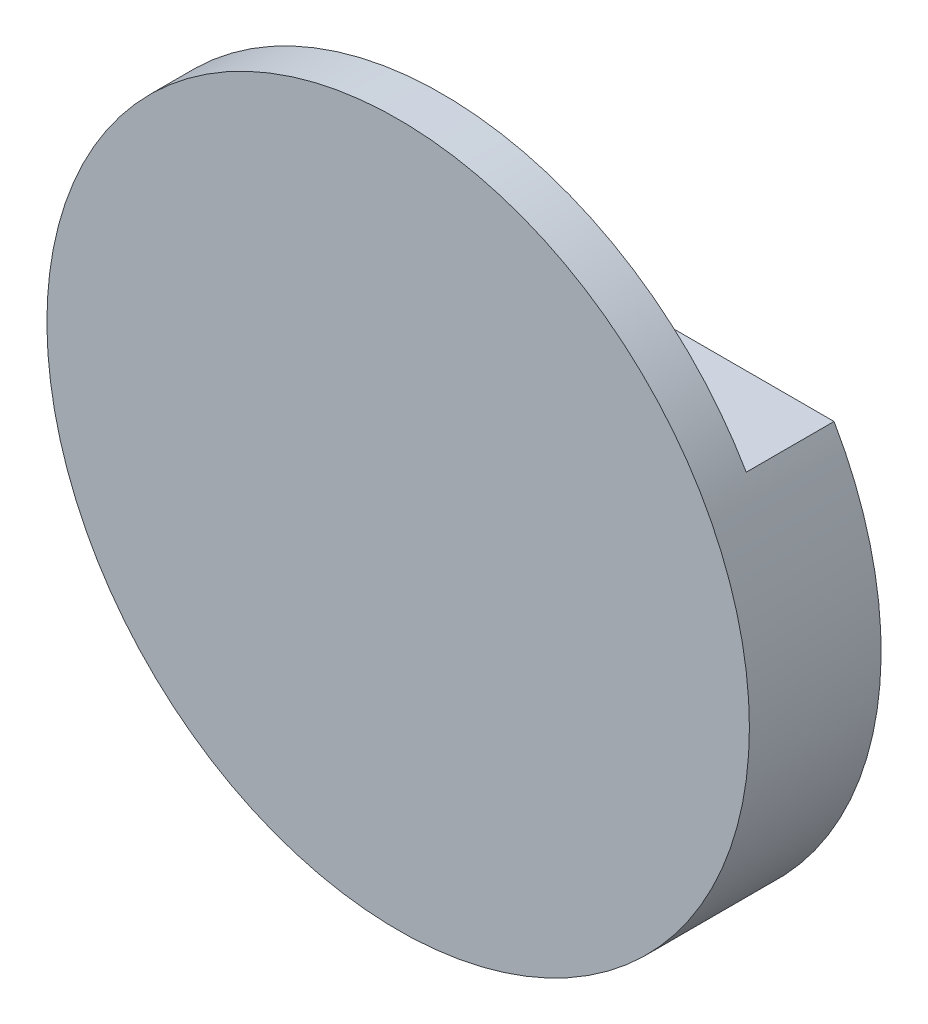
ISO-10303-21;
HEADER;
FILE_DESCRIPTION(('STEP AP214'),'2;1');
FILE_NAME('part.step','',(''),(''),'','','');
FILE_SCHEMA(('AUTOMOTIVE_DESIGN { 1 0 10303 214 1 1 1 1 }'));
ENDSEC;
DATA;
#1=APPLICATION_CONTEXT('core data for automotive mechanical design processes');
#2=APPLICATION_PROTOCOL_DEFINITION('international standard','automotive_design',2000,#1);
#3=PRODUCT_CONTEXT('',#1,'mechanical');
#4=PRODUCT('Part','Part','',(#3));
#5=PRODUCT_RELATED_PRODUCT_CATEGORY('part','',(#4));
#6=PRODUCT_DEFINITION_FORMATION('','',#4);
#7=PRODUCT_DEFINITION_CONTEXT('part definition',#1,'design');
#8=PRODUCT_DEFINITION('design','',#6,#7);
#9=PRODUCT_DEFINITION_SHAPE('','',#8);
#10=(LENGTH_UNIT() NAMED_UNIT(*) SI_UNIT(.MILLI.,.METRE.));
#11=(NAMED_UNIT(*) PLANE_ANGLE_UNIT() SI_UNIT($,.RADIAN.));
#12=(NAMED_UNIT(*) SI_UNIT($,.STERADIAN.) SOLID_ANGLE_UNIT());
#13=UNCERTAINTY_MEASURE_WITH_UNIT(LENGTH_MEASURE(1.E-05),#10,'distance_accuracy_value','');
#14=(GEOMETRIC_REPRESENTATION_CONTEXT(3) GLOBAL_UNCERTAINTY_ASSIGNED_CONTEXT((#13)) GLOBAL_UNIT_ASSIGNED_CONTEXT((#10,
#11,#12)) REPRESENTATION_CONTEXT('',''));
#15=CARTESIAN_POINT('',(0.,0.,0.));
#16=DIRECTION('',(0.,0.,1.));
#17=DIRECTION('',(1.,0.,0.));
#18=AXIS2_PLACEMENT_3D('',#15,#16,#17);
#19=CARTESIAN_POINT('',(-1.5875,3.175,1.5875));
#20=DIRECTION('',(0.,-1.,0.));
#21=DIRECTION('',(0.,0.,-1.));
#22=AXIS2_PLACEMENT_3D('',#19,#20,#21);
#23=PLANE('',#22);
#24=DIRECTION('',(-1.,0.,0.));
#25=VECTOR('',#24,1.);
#26=CARTESIAN_POINT('',(-1.5875,3.175,0.));
#27=LINE('',#26,#25);
#28=CARTESIAN_POINT('',(-1.5875,3.175,0.));
#29=VERTEX_POINT('',#28);
#30=CARTESIAN_POINT('',(-5.49926131403119,3.175,0.));
#31=VERTEX_POINT('',#30);
#32=EDGE_CURVE('E247',#29,#31,#27,.T.);
#33=ORIENTED_EDGE('',*,*,#32,.T.);
#34=DIRECTION('',(0.,0.,-1.));
#35=VECTOR('',#34,1.);
#36=CARTESIAN_POINT('',(-5.49926131403119,3.175,1.5875));
#37=LINE('',#36,#35);
#38=CARTESIAN_POINT('',(-5.49926131403119,3.175,1.5875));
#39=VERTEX_POINT('',#38);
#40=EDGE_CURVE('E176',#39,#31,#37,.T.);
#41=ORIENTED_EDGE('',*,*,#40,.F.);
#42=DIRECTION('',(-1.,0.,0.));
#43=VECTOR('',#42,1.);
#44=CARTESIAN_POINT('',(-1.5875,3.175,1.5875));
#45=LINE('',#44,#43);
#46=CARTESIAN_POINT('',(-1.5875,3.175,1.5875));
#47=VERTEX_POINT('',#46);
#48=EDGE_CURVE('E161',#47,#39,#45,.T.);
#49=ORIENTED_EDGE('',*,*,#48,.F.);
#50=DIRECTION('',(0.,0.,-1.));
#51=VECTOR('',#50,1.);
#52=CARTESIAN_POINT('',(-1.5875,3.175,1.5875));
#53=LINE('',#52,#51);
#54=EDGE_CURVE('E168',#47,#29,#53,.T.);
#55=ORIENTED_EDGE('',*,*,#54,.T.);
#56=EDGE_LOOP('',(#33,#41,#49,#55));
#57=FACE_BOUND('',#56,.T.);
#58=ADVANCED_FACE('F32',(#57),#23,.F.);
#59=CARTESIAN_POINT('',(0.,0.,1.5875));
#60=DIRECTION('',(0.,0.,-1.));
#61=DIRECTION('',(-1.,0.,0.));
#62=AXIS2_PLACEMENT_3D('',#59,#60,#61);
#63=CYLINDRICAL_SURFACE('',#62,6.35);
#64=CARTESIAN_POINT('',(0.,0.,0.));
#65=DIRECTION('',(0.,0.,1.));
#66=DIRECTION('',(1.,0.,0.));
#67=AXIS2_PLACEMENT_3D('',#64,#65,#66);
#68=CIRCLE('',#67,6.35);
#69=CARTESIAN_POINT('',(5.49926131403118,3.175,0.));
#70=VERTEX_POINT('',#69);
#71=EDGE_CURVE('E249',#31,#70,#68,.T.);
#72=ORIENTED_EDGE('',*,*,#71,.T.);
#73=DIRECTION('',(0.,0.,-1.));
#74=VECTOR('',#73,1.);
#75=CARTESIAN_POINT('',(5.49926131403118,3.175,1.5875));
#76=LINE('',#75,#74);
#77=CARTESIAN_POINT('',(5.49926131403118,3.175,1.5875));
#78=VERTEX_POINT('',#77);
#79=EDGE_CURVE('E207',#78,#70,#76,.T.);
#80=ORIENTED_EDGE('',*,*,#79,.F.);
#81=CARTESIAN_POINT('',(0.,0.,1.5875));
#82=DIRECTION('',(0.,0.,1.));
#83=DIRECTION('',(1.,0.,0.));
#84=AXIS2_PLACEMENT_3D('',#81,#82,#83);
#85=CIRCLE('',#84,6.35);
#86=EDGE_CURVE('E334',#78,#39,#85,.T.);
#87=ORIENTED_EDGE('',*,*,#86,.T.);
#88=ORIENTED_EDGE('',*,*,#40,.T.);
#89=EDGE_LOOP('',(#72,#80,#87,#88));
#90=FACE_BOUND('',#89,.T.);
#91=CARTESIAN_POINT('',(0.,0.,2.38125));
#92=DIRECTION('',(0.,0.,1.));
#93=DIRECTION('',(1.,0.,0.));
#94=AXIS2_PLACEMENT_3D('',#91,#92,#93);
#95=CIRCLE('',#94,6.35);
#96=CARTESIAN_POINT('',(6.35,0.,2.38125));
#97=VERTEX_POINT('',#96);
#98=EDGE_CURVE('E250',#97,#97,#95,.T.);
#99=ORIENTED_EDGE('',*,*,#98,.F.);
#100=EDGE_LOOP('',(#99));
#101=FACE_BOUND('',#100,.T.);
#102=ADVANCED_FACE('F332',(#90,#101),#63,.T.);
#103=CARTESIAN_POINT('',(1.5875,3.175,1.5875));
#104=DIRECTION('',(0.,-1.,0.));
#105=DIRECTION('',(1.,0.,0.));
#106=AXIS2_PLACEMENT_3D('',#103,#104,#105);
#107=PLANE('',#106);
#108=DIRECTION('',(-1.,0.,0.));
#109=VECTOR('',#108,1.);
#110=CARTESIAN_POINT('',(1.5875,3.175,0.));
#111=LINE('',#110,#109);
#112=CARTESIAN_POINT('',(1.5875,3.175,0.));
#113=VERTEX_POINT('',#112);
#114=EDGE_CURVE('E252',#70,#113,#111,.T.);
#115=ORIENTED_EDGE('',*,*,#114,.T.);
#116=DIRECTION('',(0.,0.,-1.));
#117=VECTOR('',#116,1.);
#118=CARTESIAN_POINT('',(1.5875,3.175,1.5875));
#119=LINE('',#118,#117);
#120=CARTESIAN_POINT('',(1.5875,3.175,1.5875));
#121=VERTEX_POINT('',#120);
#122=EDGE_CURVE('E204',#121,#113,#119,.T.);
#123=ORIENTED_EDGE('',*,*,#122,.F.);
#124=DIRECTION('',(-1.,0.,0.));
#125=VECTOR('',#124,1.);
#126=CARTESIAN_POINT('',(1.5875,3.175,1.5875));
#127=LINE('',#126,#125);
#128=EDGE_CURVE('E177',#78,#121,#127,.T.);
#129=ORIENTED_EDGE('',*,*,#128,.F.);
#130=ORIENTED_EDGE('',*,*,#79,.T.);
#131=EDGE_LOOP('',(#115,#123,#129,#130));
#132=FACE_BOUND('',#131,.T.);
#133=ADVANCED_FACE('F339',(#132),#107,.F.);
#134=CARTESIAN_POINT('',(1.5875,3.175,1.5875));
#135=DIRECTION('',(1.,0.,0.));
#136=DIRECTION('',(0.,1.,0.));
#137=AXIS2_PLACEMENT_3D('',#134,#135,#136);
#138=PLANE('',#137);
#139=DIRECTION('',(0.,-1.,0.));
#140=VECTOR('',#139,1.);
#141=CARTESIAN_POINT('',(1.5875,3.175,0.));
#142=LINE('',#141,#140);
#143=CARTESIAN_POINT('',(1.5875,2.0875,0.));
#144=VERTEX_POINT('',#143);
#145=EDGE_CURVE('E254',#113,#144,#142,.T.);
#146=ORIENTED_EDGE('',*,*,#145,.T.);
#147=DIRECTION('',(0.,0.,-1.));
#148=VECTOR('',#147,1.);
#149=CARTESIAN_POINT('',(1.5875,2.0875,1.5875));
#150=LINE('',#149,#148);
#151=CARTESIAN_POINT('',(1.5875,2.0875,1.5875));
#152=VERTEX_POINT('',#151);
#153=EDGE_CURVE('E47',#144,#152,#150,.F.);
#154=ORIENTED_EDGE('',*,*,#153,.T.);
#155=DIRECTION('',(0.,-1.,0.));
#156=VECTOR('',#155,1.);
#157=CARTESIAN_POINT('',(1.5875,3.175,1.5875));
#158=LINE('',#157,#156);
#159=EDGE_CURVE('E214',#121,#152,#158,.T.);
#160=ORIENTED_EDGE('',*,*,#159,.F.);
#161=ORIENTED_EDGE('',*,*,#122,.T.);
#162=EDGE_LOOP('',(#146,#154,#160,#161));
#163=FACE_BOUND('',#162,.T.);
#164=ADVANCED_FACE('F341',(#163),#138,.F.);
#165=CARTESIAN_POINT('',(1.5875,1.5875,1.5875));
#166=DIRECTION('',(0.,1.,0.));
#167=DIRECTION('',(0.,0.,1.));
#168=AXIS2_PLACEMENT_3D('',#165,#166,#167);
#169=PLANE('',#168);
#170=DIRECTION('',(1.,0.,0.));
#171=VECTOR('',#170,1.);
#172=CARTESIAN_POINT('',(1.5875,1.5875,1.5875));
#173=LINE('',#172,#171);
#174=CARTESIAN_POINT('',(2.0875,1.5875,1.5875));
#175=VERTEX_POINT('',#174);
#176=CARTESIAN_POINT('',(3.175,1.5875,1.5875));
#177=VERTEX_POINT('',#176);
#178=EDGE_CURVE('E225',#175,#177,#173,.T.);
#179=ORIENTED_EDGE('',*,*,#178,.F.);
#180=DIRECTION('',(0.,0.,-1.));
#181=VECTOR('',#180,1.);
#182=CARTESIAN_POINT('',(2.0875,1.5875,1.5875));
#183=LINE('',#182,#181);
#184=CARTESIAN_POINT('',(2.0875,1.5875,0.));
#185=VERTEX_POINT('',#184);
#186=EDGE_CURVE('E286',#175,#185,#183,.T.);
#187=ORIENTED_EDGE('',*,*,#186,.T.);
#188=DIRECTION('',(1.,0.,0.));
#189=VECTOR('',#188,1.);
#190=CARTESIAN_POINT('',(1.5875,1.5875,0.));
#191=LINE('',#190,#189);
#192=CARTESIAN_POINT('',(3.175,1.5875,0.));
#193=VERTEX_POINT('',#192);
#194=EDGE_CURVE('E256',#185,#193,#191,.T.);
#195=ORIENTED_EDGE('',*,*,#194,.T.);
#196=DIRECTION('',(0.,0.,-1.));
#197=VECTOR('',#196,1.);
#198=CARTESIAN_POINT('',(3.175,1.5875,1.5875));
#199=LINE('',#198,#197);
#200=EDGE_CURVE('E201',#177,#193,#199,.T.);
#201=ORIENTED_EDGE('',*,*,#200,.F.);
#202=EDGE_LOOP('',(#179,#187,#195,#201));
#203=FACE_BOUND('',#202,.T.);
#204=ADVANCED_FACE('F372',(#203),#169,.F.);
#205=CARTESIAN_POINT('',(3.175,1.5875,1.5875));
#206=DIRECTION('',(1.,0.,0.));
#207=DIRECTION('',(0.,1.,0.));
#208=AXIS2_PLACEMENT_3D('',#205,#206,#207);
#209=PLANE('',#208);
#210=DIRECTION('',(0.,-1.,0.));
#211=VECTOR('',#210,1.);
#212=CARTESIAN_POINT('',(3.175,1.5875,0.));
#213=LINE('',#212,#211);
#214=CARTESIAN_POINT('',(3.175,-1.5875,0.));
#215=VERTEX_POINT('',#214);
#216=EDGE_CURVE('E258',#193,#215,#213,.T.);
#217=ORIENTED_EDGE('',*,*,#216,.T.);
#218=DIRECTION('',(0.,0.,-1.));
#219=VECTOR('',#218,1.);
#220=CARTESIAN_POINT('',(3.175,-1.5875,1.5875));
#221=LINE('',#220,#219);
#222=CARTESIAN_POINT('',(3.175,-1.5875,1.5875));
#223=VERTEX_POINT('',#222);
#224=EDGE_CURVE('E198',#223,#215,#221,.T.);
#225=ORIENTED_EDGE('',*,*,#224,.F.);
#226=DIRECTION('',(0.,-1.,0.));
#227=VECTOR('',#226,1.);
#228=CARTESIAN_POINT('',(3.175,1.5875,1.5875));
#229=LINE('',#228,#227);
#230=EDGE_CURVE('E227',#177,#223,#229,.T.);
#231=ORIENTED_EDGE('',*,*,#230,.F.);
#232=ORIENTED_EDGE('',*,*,#200,.T.);
#233=EDGE_LOOP('',(#217,#225,#231,#232));
#234=FACE_BOUND('',#233,.T.);
#235=ADVANCED_FACE('F377',(#234),#209,.F.);
#236=CARTESIAN_POINT('',(1.5875,-1.5875,1.5875));
#237=DIRECTION('',(0.,-1.,0.));
#238=DIRECTION('',(0.,0.,-1.));
#239=AXIS2_PLACEMENT_3D('',#236,#237,#238);
#240=PLANE('',#239);
#241=DIRECTION('',(-1.,0.,0.));
#242=VECTOR('',#241,1.);
#243=CARTESIAN_POINT('',(1.5875,-1.5875,0.));
#244=LINE('',#243,#242);
#245=CARTESIAN_POINT('',(2.0875,-1.5875,0.));
#246=VERTEX_POINT('',#245);
#247=EDGE_CURVE('E260',#215,#246,#244,.T.);
#248=ORIENTED_EDGE('',*,*,#247,.T.);
#249=DIRECTION('',(0.,0.,-1.));
#250=VECTOR('',#249,1.);
#251=CARTESIAN_POINT('',(2.0875,-1.5875,1.5875));
#252=LINE('',#251,#250);
#253=CARTESIAN_POINT('',(2.0875,-1.5875,1.5875));
#254=VERTEX_POINT('',#253);
#255=EDGE_CURVE('E314',#246,#254,#252,.F.);
#256=ORIENTED_EDGE('',*,*,#255,.T.);
#257=DIRECTION('',(-1.,0.,0.));
#258=VECTOR('',#257,1.);
#259=CARTESIAN_POINT('',(1.5875,-1.5875,1.5875));
#260=LINE('',#259,#258);
#261=EDGE_CURVE('E230',#223,#254,#260,.T.);
#262=ORIENTED_EDGE('',*,*,#261,.F.);
#263=ORIENTED_EDGE('',*,*,#224,.T.);
#264=EDGE_LOOP('',(#248,#256,#262,#263));
#265=FACE_BOUND('',#264,.T.);
#266=ADVANCED_FACE('F381',(#265),#240,.F.);
#267=CARTESIAN_POINT('',(1.5875,-1.5875,1.5875));
#268=DIRECTION('',(1.,0.,0.));
#269=DIRECTION('',(0.,1.,0.));
#270=AXIS2_PLACEMENT_3D('',#267,#268,#269);
#271=PLANE('',#270);
#272=DIRECTION('',(0.,-1.,0.));
#273=VECTOR('',#272,1.);
#274=CARTESIAN_POINT('',(1.5875,-1.5875,1.5875));
#275=LINE('',#274,#273);
#276=CARTESIAN_POINT('',(1.5875,-2.0875,1.5875));
#277=VERTEX_POINT('',#276);
#278=CARTESIAN_POINT('',(1.5875,-3.175,1.5875));
#279=VERTEX_POINT('',#278);
#280=EDGE_CURVE('E233',#277,#279,#275,.T.);
#281=ORIENTED_EDGE('',*,*,#280,.F.);
#282=DIRECTION('',(0.,0.,-1.));
#283=VECTOR('',#282,1.);
#284=CARTESIAN_POINT('',(1.5875,-2.0875,1.5875));
#285=LINE('',#284,#283);
#286=CARTESIAN_POINT('',(1.5875,-2.0875,0.));
#287=VERTEX_POINT('',#286);
#288=EDGE_CURVE('E324',#277,#287,#285,.T.);
#289=ORIENTED_EDGE('',*,*,#288,.T.);
#290=DIRECTION('',(0.,-1.,0.));
#291=VECTOR('',#290,1.);
#292=CARTESIAN_POINT('',(1.5875,-1.5875,0.));
#293=LINE('',#292,#291);
#294=CARTESIAN_POINT('',(1.5875,-3.175,0.));
#295=VERTEX_POINT('',#294);
#296=EDGE_CURVE('E263',#287,#295,#293,.T.);
#297=ORIENTED_EDGE('',*,*,#296,.T.);
#298=DIRECTION('',(0.,0.,-1.));
#299=VECTOR('',#298,1.);
#300=CARTESIAN_POINT('',(1.5875,-3.175,1.5875));
#301=LINE('',#300,#299);
#302=EDGE_CURVE('E195',#279,#295,#301,.T.);
#303=ORIENTED_EDGE('',*,*,#302,.F.);
#304=EDGE_LOOP('',(#281,#289,#297,#303));
#305=FACE_BOUND('',#304,.T.);
#306=ADVANCED_FACE('F387',(#305),#271,.F.);
#307=CARTESIAN_POINT('',(-1.5875,-3.175,1.5875));
#308=DIRECTION('',(0.,-1.,0.));
#309=DIRECTION('',(0.,0.,-1.));
#310=AXIS2_PLACEMENT_3D('',#307,#308,#309);
#311=PLANE('',#310);
#312=DIRECTION('',(-1.,0.,0.));
#313=VECTOR('',#312,1.);
#314=CARTESIAN_POINT('',(-1.5875,-3.175,0.));
#315=LINE('',#314,#313);
#316=CARTESIAN_POINT('',(-1.5875,-3.175,0.));
#317=VERTEX_POINT('',#316);
#318=EDGE_CURVE('E265',#295,#317,#315,.T.);
#319=ORIENTED_EDGE('',*,*,#318,.T.);
#320=DIRECTION('',(0.,0.,-1.));
#321=VECTOR('',#320,1.);
#322=CARTESIAN_POINT('',(-1.5875,-3.175,1.5875));
#323=LINE('',#322,#321);
#324=CARTESIAN_POINT('',(-1.5875,-3.175,1.5875));
#325=VERTEX_POINT('',#324);
#326=EDGE_CURVE('E192',#325,#317,#323,.T.);
#327=ORIENTED_EDGE('',*,*,#326,.F.);
#328=DIRECTION('',(-1.,0.,0.));
#329=VECTOR('',#328,1.);
#330=CARTESIAN_POINT('',(-1.5875,-3.175,1.5875));
#331=LINE('',#330,#329);
#332=EDGE_CURVE('E235',#279,#325,#331,.T.);
#333=ORIENTED_EDGE('',*,*,#332,.F.);
#334=ORIENTED_EDGE('',*,*,#302,.T.);
#335=EDGE_LOOP('',(#319,#327,#333,#334));
#336=FACE_BOUND('',#335,.T.);
#337=ADVANCED_FACE('F390',(#336),#311,.F.);
#338=CARTESIAN_POINT('',(-1.5875,-1.5875,1.5875));
#339=DIRECTION('',(-1.,0.,0.));
#340=DIRECTION('',(0.,-1.,0.));
#341=AXIS2_PLACEMENT_3D('',#338,#339,#340);
#342=PLANE('',#341);
#343=DIRECTION('',(0.,1.,0.));
#344=VECTOR('',#343,1.);
#345=CARTESIAN_POINT('',(-1.5875,-1.5875,0.));
#346=LINE('',#345,#344);
#347=CARTESIAN_POINT('',(-1.5875,-2.0875,0.));
#348=VERTEX_POINT('',#347);
#349=EDGE_CURVE('E267',#317,#348,#346,.T.);
#350=ORIENTED_EDGE('',*,*,#349,.T.);
#351=DIRECTION('',(0.,0.,-1.));
#352=VECTOR('',#351,1.);
#353=CARTESIAN_POINT('',(-1.5875,-2.0875,1.5875));
#354=LINE('',#353,#352);
#355=CARTESIAN_POINT('',(-1.5875,-2.0875,1.5875));
#356=VERTEX_POINT('',#355);
#357=EDGE_CURVE('E291',#348,#356,#354,.F.);
#358=ORIENTED_EDGE('',*,*,#357,.T.);
#359=DIRECTION('',(0.,1.,0.));
#360=VECTOR('',#359,1.);
#361=CARTESIAN_POINT('',(-1.5875,-1.5875,1.5875));
#362=LINE('',#361,#360);
#363=EDGE_CURVE('E238',#325,#356,#362,.T.);
#364=ORIENTED_EDGE('',*,*,#363,.F.);
#365=ORIENTED_EDGE('',*,*,#326,.T.);
#366=EDGE_LOOP('',(#350,#358,#364,#365));
#367=FACE_BOUND('',#366,.T.);
#368=ADVANCED_FACE('F392',(#367),#342,.F.);
#369=CARTESIAN_POINT('',(-3.175,-1.5875,1.5875));
#370=DIRECTION('',(0.,-1.,0.));
#371=DIRECTION('',(1.,0.,0.));
#372=AXIS2_PLACEMENT_3D('',#369,#370,#371);
#373=PLANE('',#372);
#374=DIRECTION('',(-1.,0.,0.));
#375=VECTOR('',#374,1.);
#376=CARTESIAN_POINT('',(-3.175,-1.5875,1.5875));
#377=LINE('',#376,#375);
#378=CARTESIAN_POINT('',(-2.0875,-1.5875,1.5875));
#379=VERTEX_POINT('',#378);
#380=CARTESIAN_POINT('',(-3.175,-1.5875,1.5875));
#381=VERTEX_POINT('',#380);
#382=EDGE_CURVE('E241',#379,#381,#377,.T.);
#383=ORIENTED_EDGE('',*,*,#382,.F.);
#384=DIRECTION('',(0.,0.,-1.));
#385=VECTOR('',#384,1.);
#386=CARTESIAN_POINT('',(-2.0875,-1.5875,1.5875));
#387=LINE('',#386,#385);
#388=CARTESIAN_POINT('',(-2.0875,-1.5875,0.));
#389=VERTEX_POINT('',#388);
#390=EDGE_CURVE('E309',#379,#389,#387,.T.);
#391=ORIENTED_EDGE('',*,*,#390,.T.);
#392=DIRECTION('',(-1.,0.,0.));
#393=VECTOR('',#392,1.);
#394=CARTESIAN_POINT('',(-3.175,-1.5875,0.));
#395=LINE('',#394,#393);
#396=CARTESIAN_POINT('',(-3.175,-1.5875,0.));
#397=VERTEX_POINT('',#396);
#398=EDGE_CURVE('E270',#389,#397,#395,.T.);
#399=ORIENTED_EDGE('',*,*,#398,.T.);
#400=DIRECTION('',(0.,0.,-1.));
#401=VECTOR('',#400,1.);
#402=CARTESIAN_POINT('',(-3.175,-1.5875,1.5875));
#403=LINE('',#402,#401);
#404=EDGE_CURVE('E185',#381,#397,#403,.T.);
#405=ORIENTED_EDGE('',*,*,#404,.F.);
#406=EDGE_LOOP('',(#383,#391,#399,#405));
#407=FACE_BOUND('',#406,.T.);
#408=ADVANCED_FACE('F308',(#407),#373,.F.);
#409=CARTESIAN_POINT('',(-3.175,1.5875,1.5875));
#410=DIRECTION('',(-1.,0.,0.));
#411=DIRECTION('',(0.,0.,1.));
#412=AXIS2_PLACEMENT_3D('',#409,#410,#411);
#413=PLANE('',#412);
#414=DIRECTION('',(0.,1.,0.));
#415=VECTOR('',#414,1.);
#416=CARTESIAN_POINT('',(-3.175,1.5875,0.));
#417=LINE('',#416,#415);
#418=CARTESIAN_POINT('',(-3.175,1.5875,0.));
#419=VERTEX_POINT('',#418);
#420=EDGE_CURVE('E272',#397,#419,#417,.T.);
#421=ORIENTED_EDGE('',*,*,#420,.T.);
#422=DIRECTION('',(0.,0.,-1.));
#423=VECTOR('',#422,1.);
#424=CARTESIAN_POINT('',(-3.175,1.5875,1.5875));
#425=LINE('',#424,#423);
#426=CARTESIAN_POINT('',(-3.175,1.5875,1.5875));
#427=VERTEX_POINT('',#426);
#428=EDGE_CURVE('E182',#427,#419,#425,.T.);
#429=ORIENTED_EDGE('',*,*,#428,.F.);
#430=DIRECTION('',(0.,1.,0.));
#431=VECTOR('',#430,1.);
#432=CARTESIAN_POINT('',(-3.175,1.5875,1.5875));
#433=LINE('',#432,#431);
#434=EDGE_CURVE('E243',#381,#427,#433,.T.);
#435=ORIENTED_EDGE('',*,*,#434,.F.);
#436=ORIENTED_EDGE('',*,*,#404,.T.);
#437=EDGE_LOOP('',(#421,#429,#435,#436));
#438=FACE_BOUND('',#437,.T.);
#439=ADVANCED_FACE('F394',(#438),#413,.F.);
#440=CARTESIAN_POINT('',(-3.175,1.5875,1.5875));
#441=DIRECTION('',(0.,1.,0.));
#442=DIRECTION('',(-1.,0.,0.));
#443=AXIS2_PLACEMENT_3D('',#440,#441,#442);
#444=PLANE('',#443);
#445=DIRECTION('',(1.,0.,0.));
#446=VECTOR('',#445,1.);
#447=CARTESIAN_POINT('',(-3.175,1.5875,0.));
#448=LINE('',#447,#446);
#449=CARTESIAN_POINT('',(-2.0875,1.5875,0.));
#450=VERTEX_POINT('',#449);
#451=EDGE_CURVE('E273',#419,#450,#448,.T.);
#452=ORIENTED_EDGE('',*,*,#451,.T.);
#453=DIRECTION('',(0.,0.,-1.));
#454=VECTOR('',#453,1.);
#455=CARTESIAN_POINT('',(-2.0875,1.5875,1.5875));
#456=LINE('',#455,#454);
#457=CARTESIAN_POINT('',(-2.0875,1.5875,1.5875));
#458=VERTEX_POINT('',#457);
#459=EDGE_CURVE('E280',#450,#458,#456,.F.);
#460=ORIENTED_EDGE('',*,*,#459,.T.);
#461=DIRECTION('',(1.,0.,0.));
#462=VECTOR('',#461,1.);
#463=CARTESIAN_POINT('',(-3.175,1.5875,1.5875));
#464=LINE('',#463,#462);
#465=EDGE_CURVE('E169',#427,#458,#464,.T.);
#466=ORIENTED_EDGE('',*,*,#465,.F.);
#467=ORIENTED_EDGE('',*,*,#428,.T.);
#468=EDGE_LOOP('',(#452,#460,#466,#467));
#469=FACE_BOUND('',#468,.T.);
#470=ADVANCED_FACE('F278',(#469),#444,.F.);
#471=CARTESIAN_POINT('',(-1.5875,3.175,1.5875));
#472=DIRECTION('',(-1.,0.,0.));
#473=DIRECTION('',(0.,0.,1.));
#474=AXIS2_PLACEMENT_3D('',#471,#472,#473);
#475=PLANE('',#474);
#476=DIRECTION('',(0.,1.,0.));
#477=VECTOR('',#476,1.);
#478=CARTESIAN_POINT('',(-1.5875,3.175,1.5875));
#479=LINE('',#478,#477);
#480=CARTESIAN_POINT('',(-1.5875,2.0875,1.5875));
#481=VERTEX_POINT('',#480);
#482=EDGE_CURVE('E156',#481,#47,#479,.T.);
#483=ORIENTED_EDGE('',*,*,#482,.F.);
#484=DIRECTION('',(0.,0.,-1.));
#485=VECTOR('',#484,1.);
#486=CARTESIAN_POINT('',(-1.5875,2.0875,1.5875));
#487=LINE('',#486,#485);
#488=CARTESIAN_POINT('',(-1.5875,2.0875,0.));
#489=VERTEX_POINT('',#488);
#490=EDGE_CURVE('E287',#481,#489,#487,.T.);
#491=ORIENTED_EDGE('',*,*,#490,.T.);
#492=DIRECTION('',(0.,1.,0.));
#493=VECTOR('',#492,1.);
#494=CARTESIAN_POINT('',(-1.5875,3.175,0.));
#495=LINE('',#494,#493);
#496=EDGE_CURVE('E178',#489,#29,#495,.T.);
#497=ORIENTED_EDGE('',*,*,#496,.T.);
#498=ORIENTED_EDGE('',*,*,#54,.F.);
#499=EDGE_LOOP('',(#483,#491,#497,#498));
#500=FACE_BOUND('',#499,.T.);
#501=ADVANCED_FACE('F180',(#500),#475,.F.);
#502=CARTESIAN_POINT('',(0.,0.,0.));
#503=DIRECTION('',(0.,0.,1.));
#504=DIRECTION('',(1.,0.,0.));
#505=AXIS2_PLACEMENT_3D('',#502,#503,#504);
#506=PLANE('',#505);
#507=ORIENTED_EDGE('',*,*,#296,.F.);
#508=CARTESIAN_POINT('',(2.0875,-2.0875,0.));
#509=DIRECTION('',(0.,0.,1.));
#510=DIRECTION('',(1.,0.,0.));
#511=AXIS2_PLACEMENT_3D('',#508,#509,#510);
#512=CIRCLE('',#511,0.5);
#513=EDGE_CURVE('E316',#287,#246,#512,.F.);
#514=ORIENTED_EDGE('',*,*,#513,.T.);
#515=ORIENTED_EDGE('',*,*,#247,.F.);
#516=ORIENTED_EDGE('',*,*,#216,.F.);
#517=ORIENTED_EDGE('',*,*,#194,.F.);
#518=CARTESIAN_POINT('',(2.0875,2.0875,0.));
#519=DIRECTION('',(0.,0.,1.));
#520=DIRECTION('',(1.,0.,0.));
#521=AXIS2_PLACEMENT_3D('',#518,#519,#520);
#522=CIRCLE('',#521,0.5);
#523=EDGE_CURVE('E322',#185,#144,#522,.F.);
#524=ORIENTED_EDGE('',*,*,#523,.T.);
#525=ORIENTED_EDGE('',*,*,#145,.F.);
#526=ORIENTED_EDGE('',*,*,#114,.F.);
#527=ORIENTED_EDGE('',*,*,#71,.F.);
#528=ORIENTED_EDGE('',*,*,#32,.F.);
#529=ORIENTED_EDGE('',*,*,#496,.F.);
#530=CARTESIAN_POINT('',(-2.0875,2.0875,0.));
#531=DIRECTION('',(0.,0.,1.));
#532=DIRECTION('',(1.,0.,0.));
#533=AXIS2_PLACEMENT_3D('',#530,#531,#532);
#534=CIRCLE('',#533,0.5);
#535=EDGE_CURVE('E285',#489,#450,#534,.F.);
#536=ORIENTED_EDGE('',*,*,#535,.T.);
#537=ORIENTED_EDGE('',*,*,#451,.F.);
#538=ORIENTED_EDGE('',*,*,#420,.F.);
#539=ORIENTED_EDGE('',*,*,#398,.F.);
#540=CARTESIAN_POINT('',(-2.0875,-2.0875,0.));
#541=DIRECTION('',(0.,0.,1.));
#542=DIRECTION('',(1.,0.,0.));
#543=AXIS2_PLACEMENT_3D('',#540,#541,#542);
#544=CIRCLE('',#543,0.5);
#545=EDGE_CURVE('E313',#389,#348,#544,.F.);
#546=ORIENTED_EDGE('',*,*,#545,.T.);
#547=ORIENTED_EDGE('',*,*,#349,.F.);
#548=ORIENTED_EDGE('',*,*,#318,.F.);
#549=EDGE_LOOP('',(#507,#514,#515,#516,#517,#524,#525,#526,#527,#528,#529,#536,#537,#538,#539,
#546,#547,#548));
#550=FACE_BOUND('',#549,.T.);
#551=ADVANCED_FACE('F335',(#550),#506,.F.);
#552=CARTESIAN_POINT('',(0.,0.,1.5875));
#553=DIRECTION('',(0.,0.,1.));
#554=DIRECTION('',(1.,0.,0.));
#555=AXIS2_PLACEMENT_3D('',#552,#553,#554);
#556=PLANE('',#555);
#557=ORIENTED_EDGE('',*,*,#465,.T.);
#558=CARTESIAN_POINT('',(-2.0875,2.0875,1.5875));
#559=DIRECTION('',(0.,0.,1.));
#560=DIRECTION('',(1.,0.,0.));
#561=AXIS2_PLACEMENT_3D('',#558,#559,#560);
#562=CIRCLE('',#561,0.5);
#563=EDGE_CURVE('E40',#458,#481,#562,.T.);
#564=ORIENTED_EDGE('',*,*,#563,.T.);
#565=ORIENTED_EDGE('',*,*,#482,.T.);
#566=ORIENTED_EDGE('',*,*,#48,.T.);
#567=ORIENTED_EDGE('',*,*,#86,.F.);
#568=ORIENTED_EDGE('',*,*,#128,.T.);
#569=ORIENTED_EDGE('',*,*,#159,.T.);
#570=CARTESIAN_POINT('',(2.0875,2.0875,1.5875));
#571=DIRECTION('',(0.,0.,1.));
#572=DIRECTION('',(1.,0.,0.));
#573=AXIS2_PLACEMENT_3D('',#570,#571,#572);
#574=CIRCLE('',#573,0.5);
#575=EDGE_CURVE('E11',#152,#175,#574,.T.);
#576=ORIENTED_EDGE('',*,*,#575,.T.);
#577=ORIENTED_EDGE('',*,*,#178,.T.);
#578=ORIENTED_EDGE('',*,*,#230,.T.);
#579=ORIENTED_EDGE('',*,*,#261,.T.);
#580=CARTESIAN_POINT('',(2.0875,-2.0875,1.5875));
#581=DIRECTION('',(0.,0.,1.));
#582=DIRECTION('',(1.,0.,0.));
#583=AXIS2_PLACEMENT_3D('',#580,#581,#582);
#584=CIRCLE('',#583,0.5);
#585=EDGE_CURVE('E296',#254,#277,#584,.T.);
#586=ORIENTED_EDGE('',*,*,#585,.T.);
#587=ORIENTED_EDGE('',*,*,#280,.T.);
#588=ORIENTED_EDGE('',*,*,#332,.T.);
#589=ORIENTED_EDGE('',*,*,#363,.T.);
#590=CARTESIAN_POINT('',(-2.0875,-2.0875,1.5875));
#591=DIRECTION('',(0.,0.,1.));
#592=DIRECTION('',(1.,0.,0.));
#593=AXIS2_PLACEMENT_3D('',#590,#591,#592);
#594=CIRCLE('',#593,0.5);
#595=EDGE_CURVE('E298',#356,#379,#594,.T.);
#596=ORIENTED_EDGE('',*,*,#595,.T.);
#597=ORIENTED_EDGE('',*,*,#382,.T.);
#598=ORIENTED_EDGE('',*,*,#434,.T.);
#599=EDGE_LOOP('',(#557,#564,#565,#566,#567,#568,#569,#576,#577,#578,#579,#586,#587,#588,#589,
#596,#597,#598));
#600=FACE_BOUND('',#599,.T.);
#601=ADVANCED_FACE('F159',(#600),#556,.F.);
#602=CARTESIAN_POINT('',(0.,0.,2.38125));
#603=DIRECTION('',(0.,0.,1.));
#604=DIRECTION('',(1.,0.,0.));
#605=AXIS2_PLACEMENT_3D('',#602,#603,#604);
#606=PLANE('',#605);
#607=ORIENTED_EDGE('',*,*,#98,.T.);
#608=EDGE_LOOP('',(#607));
#609=FACE_BOUND('',#608,.T.);
#610=ADVANCED_FACE('F346',(#609),#606,.T.);
#611=CARTESIAN_POINT('',(2.0875,-2.0875,1.5875));
#612=DIRECTION('',(0.,0.,-1.));
#613=DIRECTION('',(-1.,0.,0.));
#614=AXIS2_PLACEMENT_3D('',#611,#612,#613);
#615=CYLINDRICAL_SURFACE('',#614,0.5);
#616=ORIENTED_EDGE('',*,*,#585,.F.);
#617=ORIENTED_EDGE('',*,*,#255,.F.);
#618=ORIENTED_EDGE('',*,*,#513,.F.);
#619=ORIENTED_EDGE('',*,*,#288,.F.);
#620=EDGE_LOOP('',(#616,#617,#618,#619));
#621=FACE_BOUND('',#620,.T.);
#622=ADVANCED_FACE('F357',(#621),#615,.T.);
#623=CARTESIAN_POINT('',(-2.0875,-2.0875,1.5875));
#624=DIRECTION('',(0.,0.,-1.));
#625=DIRECTION('',(-1.,0.,0.));
#626=AXIS2_PLACEMENT_3D('',#623,#624,#625);
#627=CYLINDRICAL_SURFACE('',#626,0.5);
#628=ORIENTED_EDGE('',*,*,#595,.F.);
#629=ORIENTED_EDGE('',*,*,#357,.F.);
#630=ORIENTED_EDGE('',*,*,#545,.F.);
#631=ORIENTED_EDGE('',*,*,#390,.F.);
#632=EDGE_LOOP('',(#628,#629,#630,#631));
#633=FACE_BOUND('',#632,.T.);
#634=ADVANCED_FACE('F312',(#633),#627,.T.);
#635=CARTESIAN_POINT('',(-2.0875,2.0875,1.5875));
#636=DIRECTION('',(0.,0.,-1.));
#637=DIRECTION('',(-1.,0.,0.));
#638=AXIS2_PLACEMENT_3D('',#635,#636,#637);
#639=CYLINDRICAL_SURFACE('',#638,0.5);
#640=ORIENTED_EDGE('',*,*,#563,.F.);
#641=ORIENTED_EDGE('',*,*,#459,.F.);
#642=ORIENTED_EDGE('',*,*,#535,.F.);
#643=ORIENTED_EDGE('',*,*,#490,.F.);
#644=EDGE_LOOP('',(#640,#641,#642,#643));
#645=FACE_BOUND('',#644,.T.);
#646=ADVANCED_FACE('F284',(#645),#639,.T.);
#647=CARTESIAN_POINT('',(2.0875,2.0875,1.5875));
#648=DIRECTION('',(0.,0.,-1.));
#649=DIRECTION('',(-1.,0.,0.));
#650=AXIS2_PLACEMENT_3D('',#647,#648,#649);
#651=CYLINDRICAL_SURFACE('',#650,0.5);
#652=ORIENTED_EDGE('',*,*,#575,.F.);
#653=ORIENTED_EDGE('',*,*,#153,.F.);
#654=ORIENTED_EDGE('',*,*,#523,.F.);
#655=ORIENTED_EDGE('',*,*,#186,.F.);
#656=EDGE_LOOP('',(#652,#653,#654,#655));
#657=FACE_BOUND('',#656,.T.);
#658=ADVANCED_FACE('F34',(#657),#651,.T.);
#659=CLOSED_SHELL('',(#58,#102,#133,#164,#204,#235,#266,#306,#337,#368,#408,#439,#470,#501,#551,
#601,#610,#622,#634,#646,#658));
#660=MANIFOLD_SOLID_BREP('B2',#659);
#661=ADVANCED_BREP_SHAPE_REPRESENTATION('',(#18,#660),#14);
#662=SHAPE_DEFINITION_REPRESENTATION(#9,#661);
ENDSEC;
END-ISO-10303-21;
